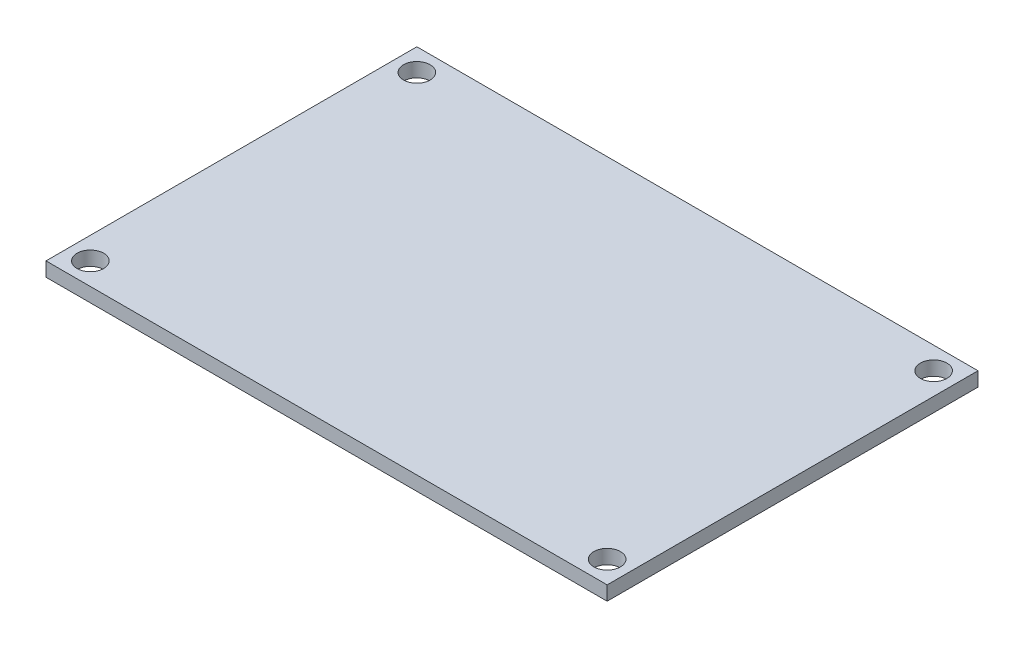
ISO-10303-21;
HEADER;
FILE_DESCRIPTION(('STEP AP214'),'2;1');
FILE_NAME('part.step','',(''),(''),'','','');
FILE_SCHEMA(('AUTOMOTIVE_DESIGN { 1 0 10303 214 1 1 1 1 }'));
ENDSEC;
DATA;
#1=APPLICATION_CONTEXT('core data for automotive mechanical design processes');
#2=APPLICATION_PROTOCOL_DEFINITION('international standard','automotive_design',2000,#1);
#3=PRODUCT_CONTEXT('',#1,'mechanical');
#4=PRODUCT('Part','Part','',(#3));
#5=PRODUCT_RELATED_PRODUCT_CATEGORY('part','',(#4));
#6=PRODUCT_DEFINITION_FORMATION('','',#4);
#7=PRODUCT_DEFINITION_CONTEXT('part definition',#1,'design');
#8=PRODUCT_DEFINITION('design','',#6,#7);
#9=PRODUCT_DEFINITION_SHAPE('','',#8);
#10=(LENGTH_UNIT() NAMED_UNIT(*) SI_UNIT(.MILLI.,.METRE.));
#11=(NAMED_UNIT(*) PLANE_ANGLE_UNIT() SI_UNIT($,.RADIAN.));
#12=(NAMED_UNIT(*) SI_UNIT($,.STERADIAN.) SOLID_ANGLE_UNIT());
#13=UNCERTAINTY_MEASURE_WITH_UNIT(LENGTH_MEASURE(1.E-05),#10,'distance_accuracy_value','');
#14=(GEOMETRIC_REPRESENTATION_CONTEXT(3) GLOBAL_UNCERTAINTY_ASSIGNED_CONTEXT((#13)) GLOBAL_UNIT_ASSIGNED_CONTEXT((#10,
#11,#12)) REPRESENTATION_CONTEXT('',''));
#15=CARTESIAN_POINT('',(0.,0.,0.));
#16=DIRECTION('',(0.,0.,1.));
#17=DIRECTION('',(1.,0.,0.));
#18=AXIS2_PLACEMENT_3D('',#15,#16,#17);
#19=CARTESIAN_POINT('',(0.,1.6,0.));
#20=DIRECTION('',(0.,-1.,0.));
#21=DIRECTION('',(0.,0.,-1.));
#22=AXIS2_PLACEMENT_3D('',#19,#20,#21);
#23=PLANE('',#22);
#24=DIRECTION('',(0.,0.,-1.));
#25=VECTOR('',#24,1.);
#26=CARTESIAN_POINT('',(31.625,1.6,20.9));
#27=LINE('',#26,#25);
#28=CARTESIAN_POINT('',(31.625,1.6,20.9));
#29=VERTEX_POINT('',#28);
#30=CARTESIAN_POINT('',(31.625,1.6,-20.9));
#31=VERTEX_POINT('',#30);
#32=EDGE_CURVE('E85',#29,#31,#27,.T.);
#33=ORIENTED_EDGE('',*,*,#32,.T.);
#34=DIRECTION('',(-1.,0.,0.));
#35=VECTOR('',#34,1.);
#36=CARTESIAN_POINT('',(-31.625,1.6,-20.9));
#37=LINE('',#36,#35);
#38=CARTESIAN_POINT('',(-31.625,1.6,-20.9));
#39=VERTEX_POINT('',#38);
#40=EDGE_CURVE('E80',#31,#39,#37,.T.);
#41=ORIENTED_EDGE('',*,*,#40,.T.);
#42=DIRECTION('',(0.,0.,1.));
#43=VECTOR('',#42,1.);
#44=CARTESIAN_POINT('',(-31.625,1.6,20.9));
#45=LINE('',#44,#43);
#46=CARTESIAN_POINT('',(-31.625,1.6,20.9));
#47=VERTEX_POINT('',#46);
#48=EDGE_CURVE('E83',#39,#47,#45,.T.);
#49=ORIENTED_EDGE('',*,*,#48,.T.);
#50=DIRECTION('',(1.,0.,0.));
#51=VECTOR('',#50,1.);
#52=CARTESIAN_POINT('',(-31.625,1.6,20.9));
#53=LINE('',#52,#51);
#54=EDGE_CURVE('E50',#47,#29,#53,.T.);
#55=ORIENTED_EDGE('',*,*,#54,.T.);
#56=EDGE_LOOP('',(#33,#41,#49,#55));
#57=FACE_BOUND('',#56,.T.);
#58=CARTESIAN_POINT('',(-29.125,1.6,-18.4));
#59=DIRECTION('',(0.,1.,0.));
#60=DIRECTION('',(0.,0.,1.));
#61=AXIS2_PLACEMENT_3D('',#58,#59,#60);
#62=CIRCLE('',#61,1.5);
#63=CARTESIAN_POINT('',(-29.125,1.6,-16.9));
#64=VERTEX_POINT('',#63);
#65=EDGE_CURVE('E100',#64,#64,#62,.T.);
#66=ORIENTED_EDGE('',*,*,#65,.F.);
#67=EDGE_LOOP('',(#66));
#68=FACE_BOUND('',#67,.T.);
#69=CARTESIAN_POINT('',(29.125,1.6,-18.4));
#70=DIRECTION('',(0.,1.,0.));
#71=DIRECTION('',(0.,0.,-1.));
#72=AXIS2_PLACEMENT_3D('',#69,#70,#71);
#73=CIRCLE('',#72,1.5);
#74=CARTESIAN_POINT('',(29.125,1.6,-19.9));
#75=VERTEX_POINT('',#74);
#76=EDGE_CURVE('E115',#75,#75,#73,.T.);
#77=ORIENTED_EDGE('',*,*,#76,.F.);
#78=EDGE_LOOP('',(#77));
#79=FACE_BOUND('',#78,.T.);
#80=CARTESIAN_POINT('',(29.125,1.6,18.4));
#81=DIRECTION('',(0.,1.,0.));
#82=DIRECTION('',(0.,0.,1.));
#83=AXIS2_PLACEMENT_3D('',#80,#81,#82);
#84=CIRCLE('',#83,1.5);
#85=CARTESIAN_POINT('',(29.125,1.6,19.9));
#86=VERTEX_POINT('',#85);
#87=EDGE_CURVE('E121',#86,#86,#84,.T.);
#88=ORIENTED_EDGE('',*,*,#87,.F.);
#89=EDGE_LOOP('',(#88));
#90=FACE_BOUND('',#89,.T.);
#91=CARTESIAN_POINT('',(-29.125,1.6,18.4));
#92=DIRECTION('',(0.,1.,0.));
#93=DIRECTION('',(0.,0.,-1.));
#94=AXIS2_PLACEMENT_3D('',#91,#92,#93);
#95=CIRCLE('',#94,1.5);
#96=CARTESIAN_POINT('',(-29.125,1.6,16.9));
#97=VERTEX_POINT('',#96);
#98=EDGE_CURVE('E127',#97,#97,#95,.T.);
#99=ORIENTED_EDGE('',*,*,#98,.F.);
#100=EDGE_LOOP('',(#99));
#101=FACE_BOUND('',#100,.T.);
#102=ADVANCED_FACE('F33',(#57,#68,#79,#90,#101),#23,.F.);
#103=CARTESIAN_POINT('',(0.,0.,0.));
#104=DIRECTION('',(0.,-1.,0.));
#105=DIRECTION('',(0.,0.,-1.));
#106=AXIS2_PLACEMENT_3D('',#103,#104,#105);
#107=PLANE('',#106);
#108=CARTESIAN_POINT('',(29.125,0.,18.4));
#109=DIRECTION('',(0.,1.,0.));
#110=DIRECTION('',(0.,0.,1.));
#111=AXIS2_PLACEMENT_3D('',#108,#109,#110);
#112=CIRCLE('',#111,1.5);
#113=CARTESIAN_POINT('',(29.125,0.,19.9));
#114=VERTEX_POINT('',#113);
#115=EDGE_CURVE('E124',#114,#114,#112,.T.);
#116=ORIENTED_EDGE('',*,*,#115,.T.);
#117=EDGE_LOOP('',(#116));
#118=FACE_BOUND('',#117,.T.);
#119=CARTESIAN_POINT('',(-29.125,0.,-18.4));
#120=DIRECTION('',(0.,1.,0.));
#121=DIRECTION('',(0.,0.,1.));
#122=AXIS2_PLACEMENT_3D('',#119,#120,#121);
#123=CIRCLE('',#122,1.5);
#124=CARTESIAN_POINT('',(-29.125,0.,-16.9));
#125=VERTEX_POINT('',#124);
#126=EDGE_CURVE('E112',#125,#125,#123,.T.);
#127=ORIENTED_EDGE('',*,*,#126,.T.);
#128=EDGE_LOOP('',(#127));
#129=FACE_BOUND('',#128,.T.);
#130=DIRECTION('',(0.,0.,-1.));
#131=VECTOR('',#130,1.);
#132=CARTESIAN_POINT('',(31.625,0.,20.9));
#133=LINE('',#132,#131);
#134=CARTESIAN_POINT('',(31.625,0.,20.9));
#135=VERTEX_POINT('',#134);
#136=CARTESIAN_POINT('',(31.625,0.,-20.9));
#137=VERTEX_POINT('',#136);
#138=EDGE_CURVE('E97',#135,#137,#133,.T.);
#139=ORIENTED_EDGE('',*,*,#138,.F.);
#140=DIRECTION('',(1.,0.,0.));
#141=VECTOR('',#140,1.);
#142=CARTESIAN_POINT('',(-31.625,0.,20.9));
#143=LINE('',#142,#141);
#144=CARTESIAN_POINT('',(-31.625,0.,20.9));
#145=VERTEX_POINT('',#144);
#146=EDGE_CURVE('E73',#145,#135,#143,.T.);
#147=ORIENTED_EDGE('',*,*,#146,.F.);
#148=DIRECTION('',(0.,0.,1.));
#149=VECTOR('',#148,1.);
#150=CARTESIAN_POINT('',(-31.625,0.,20.9));
#151=LINE('',#150,#149);
#152=CARTESIAN_POINT('',(-31.625,0.,-20.9));
#153=VERTEX_POINT('',#152);
#154=EDGE_CURVE('E67',#153,#145,#151,.T.);
#155=ORIENTED_EDGE('',*,*,#154,.F.);
#156=DIRECTION('',(-1.,0.,0.));
#157=VECTOR('',#156,1.);
#158=CARTESIAN_POINT('',(-31.625,0.,-20.9));
#159=LINE('',#158,#157);
#160=EDGE_CURVE('E89',#137,#153,#159,.T.);
#161=ORIENTED_EDGE('',*,*,#160,.F.);
#162=EDGE_LOOP('',(#139,#147,#155,#161));
#163=FACE_BOUND('',#162,.T.);
#164=CARTESIAN_POINT('',(29.125,0.,-18.4));
#165=DIRECTION('',(0.,1.,0.));
#166=DIRECTION('',(0.,0.,-1.));
#167=AXIS2_PLACEMENT_3D('',#164,#165,#166);
#168=CIRCLE('',#167,1.5);
#169=CARTESIAN_POINT('',(29.125,0.,-19.9));
#170=VERTEX_POINT('',#169);
#171=EDGE_CURVE('E118',#170,#170,#168,.T.);
#172=ORIENTED_EDGE('',*,*,#171,.T.);
#173=EDGE_LOOP('',(#172));
#174=FACE_BOUND('',#173,.T.);
#175=CARTESIAN_POINT('',(-29.125,0.,18.4));
#176=DIRECTION('',(0.,1.,0.));
#177=DIRECTION('',(0.,0.,-1.));
#178=AXIS2_PLACEMENT_3D('',#175,#176,#177);
#179=CIRCLE('',#178,1.5);
#180=CARTESIAN_POINT('',(-29.125,0.,16.9));
#181=VERTEX_POINT('',#180);
#182=EDGE_CURVE('E130',#181,#181,#179,.T.);
#183=ORIENTED_EDGE('',*,*,#182,.T.);
#184=EDGE_LOOP('',(#183));
#185=FACE_BOUND('',#184,.T.);
#186=ADVANCED_FACE('F108',(#118,#129,#163,#174,#185),#107,.T.);
#187=CARTESIAN_POINT('',(31.625,1.6,20.9));
#188=DIRECTION('',(-1.,0.,0.));
#189=DIRECTION('',(0.,0.,1.));
#190=AXIS2_PLACEMENT_3D('',#187,#188,#189);
#191=PLANE('',#190);
#192=ORIENTED_EDGE('',*,*,#138,.T.);
#193=DIRECTION('',(0.,-1.,0.));
#194=VECTOR('',#193,1.);
#195=CARTESIAN_POINT('',(31.625,1.6,-20.9));
#196=LINE('',#195,#194);
#197=EDGE_CURVE('E11',#31,#137,#196,.T.);
#198=ORIENTED_EDGE('',*,*,#197,.F.);
#199=ORIENTED_EDGE('',*,*,#32,.F.);
#200=DIRECTION('',(0.,-1.,0.));
#201=VECTOR('',#200,1.);
#202=CARTESIAN_POINT('',(31.625,1.6,20.9));
#203=LINE('',#202,#201);
#204=EDGE_CURVE('E93',#29,#135,#203,.T.);
#205=ORIENTED_EDGE('',*,*,#204,.T.);
#206=EDGE_LOOP('',(#192,#198,#199,#205));
#207=FACE_BOUND('',#206,.T.);
#208=ADVANCED_FACE('F35',(#207),#191,.F.);
#209=CARTESIAN_POINT('',(-31.625,1.6,-20.9));
#210=DIRECTION('',(0.,0.,1.));
#211=DIRECTION('',(1.,0.,0.));
#212=AXIS2_PLACEMENT_3D('',#209,#210,#211);
#213=PLANE('',#212);
#214=ORIENTED_EDGE('',*,*,#160,.T.);
#215=DIRECTION('',(0.,-1.,0.));
#216=VECTOR('',#215,1.);
#217=CARTESIAN_POINT('',(-31.625,1.6,-20.9));
#218=LINE('',#217,#216);
#219=EDGE_CURVE('E42',#39,#153,#218,.T.);
#220=ORIENTED_EDGE('',*,*,#219,.F.);
#221=ORIENTED_EDGE('',*,*,#40,.F.);
#222=ORIENTED_EDGE('',*,*,#197,.T.);
#223=EDGE_LOOP('',(#214,#220,#221,#222));
#224=FACE_BOUND('',#223,.T.);
#225=ADVANCED_FACE('F88',(#224),#213,.F.);
#226=CARTESIAN_POINT('',(-31.625,1.6,20.9));
#227=DIRECTION('',(1.,0.,0.));
#228=DIRECTION('',(0.,0.,-1.));
#229=AXIS2_PLACEMENT_3D('',#226,#227,#228);
#230=PLANE('',#229);
#231=ORIENTED_EDGE('',*,*,#154,.T.);
#232=DIRECTION('',(0.,-1.,0.));
#233=VECTOR('',#232,1.);
#234=CARTESIAN_POINT('',(-31.625,1.6,20.9));
#235=LINE('',#234,#233);
#236=EDGE_CURVE('E90',#47,#145,#235,.T.);
#237=ORIENTED_EDGE('',*,*,#236,.F.);
#238=ORIENTED_EDGE('',*,*,#48,.F.);
#239=ORIENTED_EDGE('',*,*,#219,.T.);
#240=EDGE_LOOP('',(#231,#237,#238,#239));
#241=FACE_BOUND('',#240,.T.);
#242=ADVANCED_FACE('F91',(#241),#230,.F.);
#243=CARTESIAN_POINT('',(-31.625,1.6,20.9));
#244=DIRECTION('',(0.,0.,-1.));
#245=DIRECTION('',(-1.,0.,0.));
#246=AXIS2_PLACEMENT_3D('',#243,#244,#245);
#247=PLANE('',#246);
#248=ORIENTED_EDGE('',*,*,#146,.T.);
#249=ORIENTED_EDGE('',*,*,#204,.F.);
#250=ORIENTED_EDGE('',*,*,#54,.F.);
#251=ORIENTED_EDGE('',*,*,#236,.T.);
#252=EDGE_LOOP('',(#248,#249,#250,#251));
#253=FACE_BOUND('',#252,.T.);
#254=ADVANCED_FACE('F105',(#253),#247,.F.);
#255=CARTESIAN_POINT('',(-29.125,1.6,-18.4));
#256=DIRECTION('',(0.,-1.,0.));
#257=DIRECTION('',(0.,0.,-1.));
#258=AXIS2_PLACEMENT_3D('',#255,#256,#257);
#259=CYLINDRICAL_SURFACE('',#258,1.5);
#260=ORIENTED_EDGE('',*,*,#65,.T.);
#261=EDGE_LOOP('',(#260));
#262=FACE_BOUND('',#261,.T.);
#263=ORIENTED_EDGE('',*,*,#126,.F.);
#264=EDGE_LOOP('',(#263));
#265=FACE_BOUND('',#264,.T.);
#266=ADVANCED_FACE('F147',(#262,#265),#259,.F.);
#267=CARTESIAN_POINT('',(29.125,1.6,-18.4));
#268=DIRECTION('',(0.,-1.,0.));
#269=DIRECTION('',(0.,0.,-1.));
#270=AXIS2_PLACEMENT_3D('',#267,#268,#269);
#271=CYLINDRICAL_SURFACE('',#270,1.5);
#272=ORIENTED_EDGE('',*,*,#76,.T.);
#273=EDGE_LOOP('',(#272));
#274=FACE_BOUND('',#273,.T.);
#275=ORIENTED_EDGE('',*,*,#171,.F.);
#276=EDGE_LOOP('',(#275));
#277=FACE_BOUND('',#276,.T.);
#278=ADVANCED_FACE('F193',(#274,#277),#271,.F.);
#279=CARTESIAN_POINT('',(29.125,1.6,18.4));
#280=DIRECTION('',(0.,-1.,0.));
#281=DIRECTION('',(0.,0.,-1.));
#282=AXIS2_PLACEMENT_3D('',#279,#280,#281);
#283=CYLINDRICAL_SURFACE('',#282,1.5);
#284=ORIENTED_EDGE('',*,*,#87,.T.);
#285=EDGE_LOOP('',(#284));
#286=FACE_BOUND('',#285,.T.);
#287=ORIENTED_EDGE('',*,*,#115,.F.);
#288=EDGE_LOOP('',(#287));
#289=FACE_BOUND('',#288,.T.);
#290=ADVANCED_FACE('F201',(#286,#289),#283,.F.);
#291=CARTESIAN_POINT('',(-29.125,1.6,18.4));
#292=DIRECTION('',(0.,-1.,0.));
#293=DIRECTION('',(0.,0.,-1.));
#294=AXIS2_PLACEMENT_3D('',#291,#292,#293);
#295=CYLINDRICAL_SURFACE('',#294,1.5);
#296=ORIENTED_EDGE('',*,*,#98,.T.);
#297=EDGE_LOOP('',(#296));
#298=FACE_BOUND('',#297,.T.);
#299=ORIENTED_EDGE('',*,*,#182,.F.);
#300=EDGE_LOOP('',(#299));
#301=FACE_BOUND('',#300,.T.);
#302=ADVANCED_FACE('F136',(#298,#301),#295,.F.);
#303=CLOSED_SHELL('',(#102,#186,#208,#225,#242,#254,#266,#278,#290,#302));
#304=MANIFOLD_SOLID_BREP('B2',#303);
#305=ADVANCED_BREP_SHAPE_REPRESENTATION('',(#18,#304),#14);
#306=SHAPE_DEFINITION_REPRESENTATION(#9,#305);
ENDSEC;
END-ISO-10303-21;
